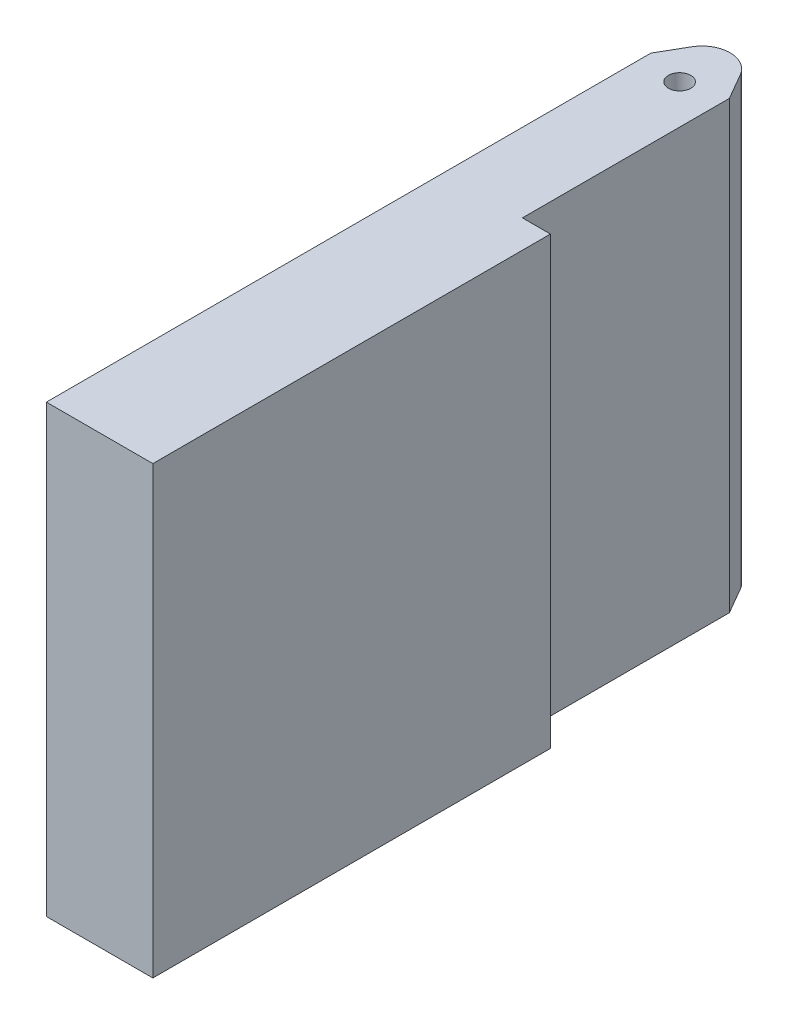
ISO-10303-21;
HEADER;
FILE_DESCRIPTION(('STEP AP214'),'2;1');
FILE_NAME('part.step','',(''),(''),'','','');
FILE_SCHEMA(('AUTOMOTIVE_DESIGN { 1 0 10303 214 1 1 1 1 }'));
ENDSEC;
DATA;
#1=APPLICATION_CONTEXT('core data for automotive mechanical design processes');
#2=APPLICATION_PROTOCOL_DEFINITION('international standard','automotive_design',2000,#1);
#3=PRODUCT_CONTEXT('',#1,'mechanical');
#4=PRODUCT('Part','Part','',(#3));
#5=PRODUCT_RELATED_PRODUCT_CATEGORY('part','',(#4));
#6=PRODUCT_DEFINITION_FORMATION('','',#4);
#7=PRODUCT_DEFINITION_CONTEXT('part definition',#1,'design');
#8=PRODUCT_DEFINITION('design','',#6,#7);
#9=PRODUCT_DEFINITION_SHAPE('','',#8);
#10=(LENGTH_UNIT() NAMED_UNIT(*) SI_UNIT(.MILLI.,.METRE.));
#11=(NAMED_UNIT(*) PLANE_ANGLE_UNIT() SI_UNIT($,.RADIAN.));
#12=(NAMED_UNIT(*) SI_UNIT($,.STERADIAN.) SOLID_ANGLE_UNIT());
#13=UNCERTAINTY_MEASURE_WITH_UNIT(LENGTH_MEASURE(1.E-05),#10,'distance_accuracy_value','');
#14=(GEOMETRIC_REPRESENTATION_CONTEXT(3) GLOBAL_UNCERTAINTY_ASSIGNED_CONTEXT((#13)) GLOBAL_UNIT_ASSIGNED_CONTEXT((#10,
#11,#12)) REPRESENTATION_CONTEXT('',''));
#15=CARTESIAN_POINT('',(0.,0.,0.));
#16=DIRECTION('',(0.,0.,1.));
#17=DIRECTION('',(1.,0.,0.));
#18=AXIS2_PLACEMENT_3D('',#15,#16,#17);
#19=CARTESIAN_POINT('',(0.,0.,-49.9999999999999));
#20=DIRECTION('',(0.,-1.,0.));
#21=DIRECTION('',(0.,0.,-1.));
#22=AXIS2_PLACEMENT_3D('',#19,#20,#21);
#23=CYLINDRICAL_SURFACE('',#22,5.);
#24=DIRECTION('',(0.,-1.,0.));
#25=VECTOR('',#24,1.);
#26=CARTESIAN_POINT('',(-4.33012701892221,0.,-52.4999999999999));
#27=LINE('',#26,#25);
#28=CARTESIAN_POINT('',(-4.33012701892221,79.5,-52.4999999999999));
#29=VERTEX_POINT('',#28);
#30=CARTESIAN_POINT('',(-4.33012701892221,0.,-52.4999999999999));
#31=VERTEX_POINT('',#30);
#32=EDGE_CURVE('E156',#29,#31,#27,.T.);
#33=ORIENTED_EDGE('',*,*,#32,.F.);
#34=CARTESIAN_POINT('',(0.,79.5,-49.9999999999999));
#35=DIRECTION('',(0.,1.,0.));
#36=DIRECTION('',(0.,0.,1.));
#37=AXIS2_PLACEMENT_3D('',#34,#35,#36);
#38=CIRCLE('',#37,5.);
#39=CARTESIAN_POINT('',(4.3301270189222,79.5,-52.4999999999999));
#40=VERTEX_POINT('',#39);
#41=EDGE_CURVE('E41',#40,#29,#38,.T.);
#42=ORIENTED_EDGE('',*,*,#41,.F.);
#43=DIRECTION('',(0.,-1.,0.));
#44=VECTOR('',#43,1.);
#45=CARTESIAN_POINT('',(4.3301270189222,0.,-52.4999999999999));
#46=LINE('',#45,#44);
#47=CARTESIAN_POINT('',(4.3301270189222,0.,-52.4999999999999));
#48=VERTEX_POINT('',#47);
#49=EDGE_CURVE('E161',#48,#40,#46,.F.);
#50=ORIENTED_EDGE('',*,*,#49,.F.);
#51=CARTESIAN_POINT('',(0.,0.,-49.9999999999999));
#52=DIRECTION('',(0.,1.,0.));
#53=DIRECTION('',(0.,0.,1.));
#54=AXIS2_PLACEMENT_3D('',#51,#52,#53);
#55=CIRCLE('',#54,5.);
#56=EDGE_CURVE('E12',#31,#48,#55,.F.);
#57=ORIENTED_EDGE('',*,*,#56,.F.);
#58=EDGE_LOOP('',(#33,#42,#50,#57));
#59=FACE_BOUND('',#58,.T.);
#60=ADVANCED_FACE('F34',(#59),#23,.T.);
#61=CARTESIAN_POINT('',(0.,79.5,0.));
#62=DIRECTION('',(0.,1.,0.));
#63=DIRECTION('',(0.,0.,1.));
#64=AXIS2_PLACEMENT_3D('',#61,#62,#63);
#65=PLANE('',#64);
#66=DIRECTION('',(1.,0.,0.));
#67=VECTOR('',#66,1.);
#68=CARTESIAN_POINT('',(7.,79.5,-10.9474411167422));
#69=LINE('',#68,#67);
#70=CARTESIAN_POINT('',(7.,79.5,-10.9474411167422));
#71=VERTEX_POINT('',#70);
#72=CARTESIAN_POINT('',(12.,79.5,-10.9474411167422));
#73=VERTEX_POINT('',#72);
#74=EDGE_CURVE('E48',#71,#73,#69,.T.);
#75=ORIENTED_EDGE('',*,*,#74,.F.);
#76=DIRECTION('',(0.,0.,1.));
#77=VECTOR('',#76,1.);
#78=CARTESIAN_POINT('',(7.,79.5,-36.9474411167422));
#79=LINE('',#78,#77);
#80=CARTESIAN_POINT('',(7.,79.5,-47.8756443470177));
#81=VERTEX_POINT('',#80);
#82=EDGE_CURVE('E105',#81,#71,#79,.T.);
#83=ORIENTED_EDGE('',*,*,#82,.F.);
#84=DIRECTION('',(-0.499999999999997,0.,-0.866025403784441));
#85=VECTOR('',#84,1.);
#86=CARTESIAN_POINT('',(11.,79.5,-40.9474411167422));
#87=LINE('',#86,#85);
#88=EDGE_CURVE('E143',#81,#40,#87,.T.);
#89=ORIENTED_EDGE('',*,*,#88,.T.);
#90=ORIENTED_EDGE('',*,*,#41,.T.);
#91=DIRECTION('',(-0.499999999999996,0.,0.866025403784441));
#92=VECTOR('',#91,1.);
#93=CARTESIAN_POINT('',(0.,79.5,-60.));
#94=LINE('',#93,#92);
#95=CARTESIAN_POINT('',(-6.99999999999996,79.5,-47.8756443470178));
#96=VERTEX_POINT('',#95);
#97=EDGE_CURVE('E146',#29,#96,#94,.T.);
#98=ORIENTED_EDGE('',*,*,#97,.T.);
#99=DIRECTION('',(0.,0.,-1.));
#100=VECTOR('',#99,1.);
#101=CARTESIAN_POINT('',(-7.00000000000001,79.5,-36.9474411167422));
#102=LINE('',#101,#100);
#103=CARTESIAN_POINT('',(-7.00000000000001,79.5,60.));
#104=VERTEX_POINT('',#103);
#105=EDGE_CURVE('E135',#104,#96,#102,.T.);
#106=ORIENTED_EDGE('',*,*,#105,.F.);
#107=DIRECTION('',(1.,0.,0.));
#108=VECTOR('',#107,1.);
#109=CARTESIAN_POINT('',(-11.,79.5,60.));
#110=LINE('',#109,#108);
#111=CARTESIAN_POINT('',(12.,79.5,60.));
#112=VERTEX_POINT('',#111);
#113=EDGE_CURVE('E153',#104,#112,#110,.T.);
#114=ORIENTED_EDGE('',*,*,#113,.T.);
#115=DIRECTION('',(0.,0.,1.));
#116=VECTOR('',#115,1.);
#117=CARTESIAN_POINT('',(12.,79.5,-36.9474411167422));
#118=LINE('',#117,#116);
#119=EDGE_CURVE('E121',#73,#112,#118,.T.);
#120=ORIENTED_EDGE('',*,*,#119,.F.);
#121=EDGE_LOOP('',(#75,#83,#89,#90,#98,#106,#114,#120));
#122=FACE_BOUND('',#121,.T.);
#123=CARTESIAN_POINT('',(0.,79.5,-45.9999999999999));
#124=DIRECTION('',(0.,1.,0.));
#125=DIRECTION('',(0.,0.,1.));
#126=AXIS2_PLACEMENT_3D('',#123,#124,#125);
#127=CIRCLE('',#126,2.);
#128=CARTESIAN_POINT('',(0.,79.5,-43.9999999999999));
#129=VERTEX_POINT('',#128);
#130=EDGE_CURVE('E116',#129,#129,#127,.T.);
#131=ORIENTED_EDGE('',*,*,#130,.F.);
#132=EDGE_LOOP('',(#131));
#133=FACE_BOUND('',#132,.T.);
#134=ADVANCED_FACE('F166',(#122,#133),#65,.T.);
#135=CARTESIAN_POINT('',(0.,0.,0.));
#136=DIRECTION('',(0.,1.,0.));
#137=DIRECTION('',(0.,0.,1.));
#138=AXIS2_PLACEMENT_3D('',#135,#136,#137);
#139=PLANE('',#138);
#140=CARTESIAN_POINT('',(0.,0.,-45.9999999999999));
#141=DIRECTION('',(0.,1.,0.));
#142=DIRECTION('',(0.,0.,1.));
#143=AXIS2_PLACEMENT_3D('',#140,#141,#142);
#144=CIRCLE('',#143,2.);
#145=CARTESIAN_POINT('',(0.,0.,-43.9999999999999));
#146=VERTEX_POINT('',#145);
#147=EDGE_CURVE('E118',#146,#146,#144,.T.);
#148=ORIENTED_EDGE('',*,*,#147,.T.);
#149=EDGE_LOOP('',(#148));
#150=FACE_BOUND('',#149,.T.);
#151=DIRECTION('',(0.,0.,1.));
#152=VECTOR('',#151,1.);
#153=CARTESIAN_POINT('',(7.,0.,-36.9474411167422));
#154=LINE('',#153,#152);
#155=CARTESIAN_POINT('',(7.00000000000004,0.,-47.8756443470177));
#156=VERTEX_POINT('',#155);
#157=CARTESIAN_POINT('',(7.,0.,-10.9474411167422));
#158=VERTEX_POINT('',#157);
#159=EDGE_CURVE('E56',#156,#158,#154,.T.);
#160=ORIENTED_EDGE('',*,*,#159,.T.);
#161=DIRECTION('',(1.,0.,0.));
#162=VECTOR('',#161,1.);
#163=CARTESIAN_POINT('',(7.,0.,-10.9474411167422));
#164=LINE('',#163,#162);
#165=CARTESIAN_POINT('',(12.,0.,-10.9474411167422));
#166=VERTEX_POINT('',#165);
#167=EDGE_CURVE('E101',#158,#166,#164,.T.);
#168=ORIENTED_EDGE('',*,*,#167,.T.);
#169=DIRECTION('',(0.,0.,1.));
#170=VECTOR('',#169,1.);
#171=CARTESIAN_POINT('',(12.,0.,-36.9474411167422));
#172=LINE('',#171,#170);
#173=CARTESIAN_POINT('',(12.,0.,60.));
#174=VERTEX_POINT('',#173);
#175=EDGE_CURVE('E124',#166,#174,#172,.T.);
#176=ORIENTED_EDGE('',*,*,#175,.T.);
#177=DIRECTION('',(1.,0.,0.));
#178=VECTOR('',#177,1.);
#179=CARTESIAN_POINT('',(-11.,0.,60.));
#180=LINE('',#179,#178);
#181=CARTESIAN_POINT('',(-7.00000000000001,0.,60.));
#182=VERTEX_POINT('',#181);
#183=EDGE_CURVE('E149',#182,#174,#180,.T.);
#184=ORIENTED_EDGE('',*,*,#183,.F.);
#185=DIRECTION('',(0.,0.,-1.));
#186=VECTOR('',#185,1.);
#187=CARTESIAN_POINT('',(-7.00000000000001,0.,-36.9474411167422));
#188=LINE('',#187,#186);
#189=CARTESIAN_POINT('',(-7.00000000000001,0.,-47.8756443470178));
#190=VERTEX_POINT('',#189);
#191=EDGE_CURVE('E136',#182,#190,#188,.T.);
#192=ORIENTED_EDGE('',*,*,#191,.T.);
#193=DIRECTION('',(-0.499999999999996,0.,0.866025403784441));
#194=VECTOR('',#193,1.);
#195=CARTESIAN_POINT('',(0.,0.,-60.));
#196=LINE('',#195,#194);
#197=EDGE_CURVE('E145',#31,#190,#196,.T.);
#198=ORIENTED_EDGE('',*,*,#197,.F.);
#199=ORIENTED_EDGE('',*,*,#56,.T.);
#200=DIRECTION('',(-0.499999999999997,0.,-0.866025403784441));
#201=VECTOR('',#200,1.);
#202=CARTESIAN_POINT('',(11.,0.,-40.9474411167422));
#203=LINE('',#202,#201);
#204=EDGE_CURVE('E103',#156,#48,#203,.T.);
#205=ORIENTED_EDGE('',*,*,#204,.F.);
#206=EDGE_LOOP('',(#160,#168,#176,#184,#192,#198,#199,#205));
#207=FACE_BOUND('',#206,.T.);
#208=ADVANCED_FACE('F99',(#150,#207),#139,.F.);
#209=CARTESIAN_POINT('',(-11.,79.5,60.));
#210=DIRECTION('',(0.,0.,-1.));
#211=DIRECTION('',(-1.,0.,0.));
#212=AXIS2_PLACEMENT_3D('',#209,#210,#211);
#213=PLANE('',#212);
#214=ORIENTED_EDGE('',*,*,#183,.T.);
#215=DIRECTION('',(0.,1.,0.));
#216=VECTOR('',#215,1.);
#217=CARTESIAN_POINT('',(12.,0.,60.));
#218=LINE('',#217,#216);
#219=EDGE_CURVE('E126',#174,#112,#218,.T.);
#220=ORIENTED_EDGE('',*,*,#219,.T.);
#221=ORIENTED_EDGE('',*,*,#113,.F.);
#222=DIRECTION('',(0.,1.,0.));
#223=VECTOR('',#222,1.);
#224=CARTESIAN_POINT('',(-7.00000000000001,0.,60.));
#225=LINE('',#224,#223);
#226=EDGE_CURVE('E130',#182,#104,#225,.T.);
#227=ORIENTED_EDGE('',*,*,#226,.F.);
#228=EDGE_LOOP('',(#214,#220,#221,#227));
#229=FACE_BOUND('',#228,.T.);
#230=ADVANCED_FACE('F181',(#229),#213,.F.);
#231=CARTESIAN_POINT('',(11.,0.,-40.9474411167422));
#232=DIRECTION('',(0.866025403784441,0.,-0.499999999999997));
#233=DIRECTION('',(-0.499999999999997,0.,-0.866025403784441));
#234=AXIS2_PLACEMENT_3D('',#231,#232,#233);
#235=PLANE('',#234);
#236=DIRECTION('',(0.,1.,0.));
#237=VECTOR('',#236,1.);
#238=CARTESIAN_POINT('',(7.,0.,-47.8756443470177));
#239=LINE('',#238,#237);
#240=EDGE_CURVE('E104',#156,#81,#239,.T.);
#241=ORIENTED_EDGE('',*,*,#240,.F.);
#242=ORIENTED_EDGE('',*,*,#204,.T.);
#243=ORIENTED_EDGE('',*,*,#49,.T.);
#244=ORIENTED_EDGE('',*,*,#88,.F.);
#245=EDGE_LOOP('',(#241,#242,#243,#244));
#246=FACE_BOUND('',#245,.T.);
#247=ADVANCED_FACE('F210',(#246),#235,.T.);
#248=CARTESIAN_POINT('',(0.,0.,-60.));
#249=DIRECTION('',(-0.866025403784441,0.,-0.499999999999996));
#250=DIRECTION('',(-0.499999999999996,0.,0.866025403784441));
#251=AXIS2_PLACEMENT_3D('',#248,#249,#250);
#252=PLANE('',#251);
#253=DIRECTION('',(0.,1.,0.));
#254=VECTOR('',#253,1.);
#255=CARTESIAN_POINT('',(-7.00000000000001,0.,-47.8756443470178));
#256=LINE('',#255,#254);
#257=EDGE_CURVE('E139',#190,#96,#256,.T.);
#258=ORIENTED_EDGE('',*,*,#257,.T.);
#259=ORIENTED_EDGE('',*,*,#97,.F.);
#260=ORIENTED_EDGE('',*,*,#32,.T.);
#261=ORIENTED_EDGE('',*,*,#197,.T.);
#262=EDGE_LOOP('',(#258,#259,#260,#261));
#263=FACE_BOUND('',#262,.T.);
#264=ADVANCED_FACE('F174',(#263),#252,.T.);
#265=CARTESIAN_POINT('',(-7.00000000000001,0.,-36.9474411167422));
#266=DIRECTION('',(1.,0.,0.));
#267=DIRECTION('',(0.,0.,-1.));
#268=AXIS2_PLACEMENT_3D('',#265,#266,#267);
#269=PLANE('',#268);
#270=ORIENTED_EDGE('',*,*,#105,.T.);
#271=ORIENTED_EDGE('',*,*,#257,.F.);
#272=ORIENTED_EDGE('',*,*,#191,.F.);
#273=ORIENTED_EDGE('',*,*,#226,.T.);
#274=EDGE_LOOP('',(#270,#271,#272,#273));
#275=FACE_BOUND('',#274,.T.);
#276=ADVANCED_FACE('F176',(#275),#269,.F.);
#277=CARTESIAN_POINT('',(7.,0.,-36.9474411167422));
#278=DIRECTION('',(-1.,0.,0.));
#279=DIRECTION('',(0.,0.,1.));
#280=AXIS2_PLACEMENT_3D('',#277,#278,#279);
#281=PLANE('',#280);
#282=ORIENTED_EDGE('',*,*,#82,.T.);
#283=DIRECTION('',(0.,1.,0.));
#284=VECTOR('',#283,1.);
#285=CARTESIAN_POINT('',(7.,0.,-10.9474411167422));
#286=LINE('',#285,#284);
#287=EDGE_CURVE('E107',#158,#71,#286,.T.);
#288=ORIENTED_EDGE('',*,*,#287,.F.);
#289=ORIENTED_EDGE('',*,*,#159,.F.);
#290=ORIENTED_EDGE('',*,*,#240,.T.);
#291=EDGE_LOOP('',(#282,#288,#289,#290));
#292=FACE_BOUND('',#291,.T.);
#293=ADVANCED_FACE('F108',(#292),#281,.F.);
#294=CARTESIAN_POINT('',(12.,0.,-36.9474411167422));
#295=DIRECTION('',(-1.,0.,0.));
#296=DIRECTION('',(0.,0.,1.));
#297=AXIS2_PLACEMENT_3D('',#294,#295,#296);
#298=PLANE('',#297);
#299=ORIENTED_EDGE('',*,*,#175,.F.);
#300=DIRECTION('',(0.,1.,0.));
#301=VECTOR('',#300,1.);
#302=CARTESIAN_POINT('',(12.,0.,-10.9474411167422));
#303=LINE('',#302,#301);
#304=EDGE_CURVE('E110',#166,#73,#303,.T.);
#305=ORIENTED_EDGE('',*,*,#304,.T.);
#306=ORIENTED_EDGE('',*,*,#119,.T.);
#307=ORIENTED_EDGE('',*,*,#219,.F.);
#308=EDGE_LOOP('',(#299,#305,#306,#307));
#309=FACE_BOUND('',#308,.T.);
#310=ADVANCED_FACE('F185',(#309),#298,.F.);
#311=CARTESIAN_POINT('',(0.,0.,-45.9999999999999));
#312=DIRECTION('',(0.,1.,0.));
#313=DIRECTION('',(0.,0.,1.));
#314=AXIS2_PLACEMENT_3D('',#311,#312,#313);
#315=CYLINDRICAL_SURFACE('',#314,2.);
#316=CARTESIAN_POINT('',(0.,0.,-43.9999999999999));
#317=CARTESIAN_POINT('',(0.,0.828124999999999,-43.9999999999999));
#318=CARTESIAN_POINT('',(0.,1.65625,-43.9999999999999));
#319=CARTESIAN_POINT('',(0.,3.3125,-43.9999999999999));
#320=CARTESIAN_POINT('',(0.,4.140625,-43.9999999999999));
#321=CARTESIAN_POINT('',(0.,5.796875,-43.9999999999999));
#322=CARTESIAN_POINT('',(0.,6.625,-43.9999999999999));
#323=CARTESIAN_POINT('',(0.,8.28125,-43.9999999999999));
#324=CARTESIAN_POINT('',(0.,9.109375,-43.9999999999999));
#325=CARTESIAN_POINT('',(0.,10.765625,-43.9999999999999));
#326=CARTESIAN_POINT('',(0.,11.59375,-43.9999999999999));
#327=CARTESIAN_POINT('',(0.,13.25,-43.9999999999999));
#328=CARTESIAN_POINT('',(0.,14.078125,-43.9999999999999));
#329=CARTESIAN_POINT('',(0.,15.734375,-43.9999999999999));
#330=CARTESIAN_POINT('',(0.,16.5625,-43.9999999999999));
#331=CARTESIAN_POINT('',(0.,18.21875,-43.9999999999999));
#332=CARTESIAN_POINT('',(0.,19.046875,-43.9999999999999));
#333=CARTESIAN_POINT('',(0.,20.703125,-43.9999999999999));
#334=CARTESIAN_POINT('',(0.,21.53125,-43.9999999999999));
#335=CARTESIAN_POINT('',(0.,23.1875,-43.9999999999999));
#336=CARTESIAN_POINT('',(0.,24.015625,-43.9999999999999));
#337=CARTESIAN_POINT('',(0.,25.671875,-43.9999999999999));
#338=CARTESIAN_POINT('',(0.,26.5,-43.9999999999999));
#339=CARTESIAN_POINT('',(0.,28.15625,-43.9999999999999));
#340=CARTESIAN_POINT('',(0.,28.984375,-43.9999999999999));
#341=CARTESIAN_POINT('',(0.,30.640625,-43.9999999999999));
#342=CARTESIAN_POINT('',(0.,31.46875,-43.9999999999999));
#343=CARTESIAN_POINT('',(0.,33.125,-43.9999999999999));
#344=CARTESIAN_POINT('',(0.,33.953125,-43.9999999999999));
#345=CARTESIAN_POINT('',(0.,35.609375,-43.9999999999999));
#346=CARTESIAN_POINT('',(0.,36.4375,-43.9999999999999));
#347=CARTESIAN_POINT('',(0.,38.09375,-43.9999999999999));
#348=CARTESIAN_POINT('',(0.,38.921875,-43.9999999999999));
#349=CARTESIAN_POINT('',(0.,40.578125,-43.9999999999999));
#350=CARTESIAN_POINT('',(0.,41.40625,-43.9999999999999));
#351=CARTESIAN_POINT('',(0.,43.0625,-43.9999999999999));
#352=CARTESIAN_POINT('',(0.,43.890625,-43.9999999999999));
#353=CARTESIAN_POINT('',(0.,45.546875,-43.9999999999999));
#354=CARTESIAN_POINT('',(0.,46.375,-43.9999999999999));
#355=CARTESIAN_POINT('',(0.,48.03125,-43.9999999999999));
#356=CARTESIAN_POINT('',(0.,48.859375,-43.9999999999999));
#357=CARTESIAN_POINT('',(0.,50.515625,-43.9999999999999));
#358=CARTESIAN_POINT('',(0.,51.34375,-43.9999999999999));
#359=CARTESIAN_POINT('',(0.,53.,-43.9999999999999));
#360=CARTESIAN_POINT('',(0.,53.828125,-43.9999999999999));
#361=CARTESIAN_POINT('',(0.,55.484375,-43.9999999999999));
#362=CARTESIAN_POINT('',(0.,56.3125,-43.9999999999999));
#363=CARTESIAN_POINT('',(0.,57.96875,-43.9999999999999));
#364=CARTESIAN_POINT('',(0.,58.796875,-43.9999999999999));
#365=CARTESIAN_POINT('',(0.,60.453125,-43.9999999999999));
#366=CARTESIAN_POINT('',(0.,61.28125,-43.9999999999999));
#367=CARTESIAN_POINT('',(0.,62.9375,-43.9999999999999));
#368=CARTESIAN_POINT('',(0.,63.765625,-43.9999999999999));
#369=CARTESIAN_POINT('',(0.,65.421875,-43.9999999999999));
#370=CARTESIAN_POINT('',(0.,66.25,-43.9999999999999));
#371=CARTESIAN_POINT('',(0.,67.90625,-43.9999999999999));
#372=CARTESIAN_POINT('',(0.,68.734375,-43.9999999999999));
#373=CARTESIAN_POINT('',(0.,70.390625,-43.9999999999999));
#374=CARTESIAN_POINT('',(0.,71.21875,-43.9999999999999));
#375=CARTESIAN_POINT('',(0.,72.875,-43.9999999999999));
#376=CARTESIAN_POINT('',(0.,73.703125,-43.9999999999999));
#377=CARTESIAN_POINT('',(0.,75.359375,-43.9999999999999));
#378=CARTESIAN_POINT('',(0.,76.1875,-43.9999999999999));
#379=CARTESIAN_POINT('',(0.,77.84375,-43.9999999999999));
#380=CARTESIAN_POINT('',(0.,78.671875,-43.9999999999999));
#381=CARTESIAN_POINT('',(0.,79.5,-43.9999999999999));
#382=B_SPLINE_CURVE_WITH_KNOTS('',3,(#316,#317,#318,#319,#320,#321,#322,#323,#324,#325,#326,
#327,#328,#329,#330,#331,#332,#333,#334,#335,#336,#337,#338,#339,#340,#341,#342,#343,#344,#345,
#346,#347,#348,#349,#350,#351,#352,#353,#354,#355,#356,#357,#358,#359,#360,#361,#362,#363,#364,
#365,#366,#367,#368,#369,#370,#371,#372,#373,#374,#375,#376,#377,#378,#379,#380,#381),
.UNSPECIFIED.,.F.,.F.,(4,2,2,2,2,2,2,2,2,2,2,2,2,2,2,2,2,2,2,2,2,2,2,2,2,2,2,2,2,2,2,2,4),(0.,
2.484375,4.96875,7.453125,9.9375,12.421875,14.90625,17.390625,19.875,22.359375,24.84375,
27.328125,29.8125,32.296875,34.78125,37.265625,39.75,42.234375,44.71875,47.203125,49.6875,
52.171875,54.65625,57.140625,59.625,62.109375,64.59375,67.078125,69.5625,72.046875,74.53125,
77.015625,79.5),.UNSPECIFIED.);
#383=EDGE_CURVE('BSEAM187',#146,#129,#382,.T.);
#384=ORIENTED_EDGE('',*,*,#147,.F.);
#385=ORIENTED_EDGE('',*,*,#130,.T.);
#386=ORIENTED_EDGE('',*,*,#383,.T.);
#387=ORIENTED_EDGE('',*,*,#383,.F.);
#388=EDGE_LOOP('',(#384,#386,#385,#387));
#389=FACE_BOUND('',#388,.T.);
#390=ADVANCED_FACE('F187',(#389),#315,.F.);
#391=CARTESIAN_POINT('',(7.,0.,-10.9474411167422));
#392=DIRECTION('',(0.,0.,1.));
#393=DIRECTION('',(1.,0.,0.));
#394=AXIS2_PLACEMENT_3D('',#391,#392,#393);
#395=PLANE('',#394);
#396=ORIENTED_EDGE('',*,*,#74,.T.);
#397=ORIENTED_EDGE('',*,*,#304,.F.);
#398=ORIENTED_EDGE('',*,*,#167,.F.);
#399=ORIENTED_EDGE('',*,*,#287,.T.);
#400=EDGE_LOOP('',(#396,#397,#398,#399));
#401=FACE_BOUND('',#400,.T.);
#402=ADVANCED_FACE('F112',(#401),#395,.F.);
#403=CLOSED_SHELL('',(#60,#134,#208,#230,#247,#264,#276,#293,#310,#390,#402));
#404=MANIFOLD_SOLID_BREP('B2',#403);
#405=ADVANCED_BREP_SHAPE_REPRESENTATION('',(#18,#404),#14);
#406=SHAPE_DEFINITION_REPRESENTATION(#9,#405);
ENDSEC;
END-ISO-10303-21;
